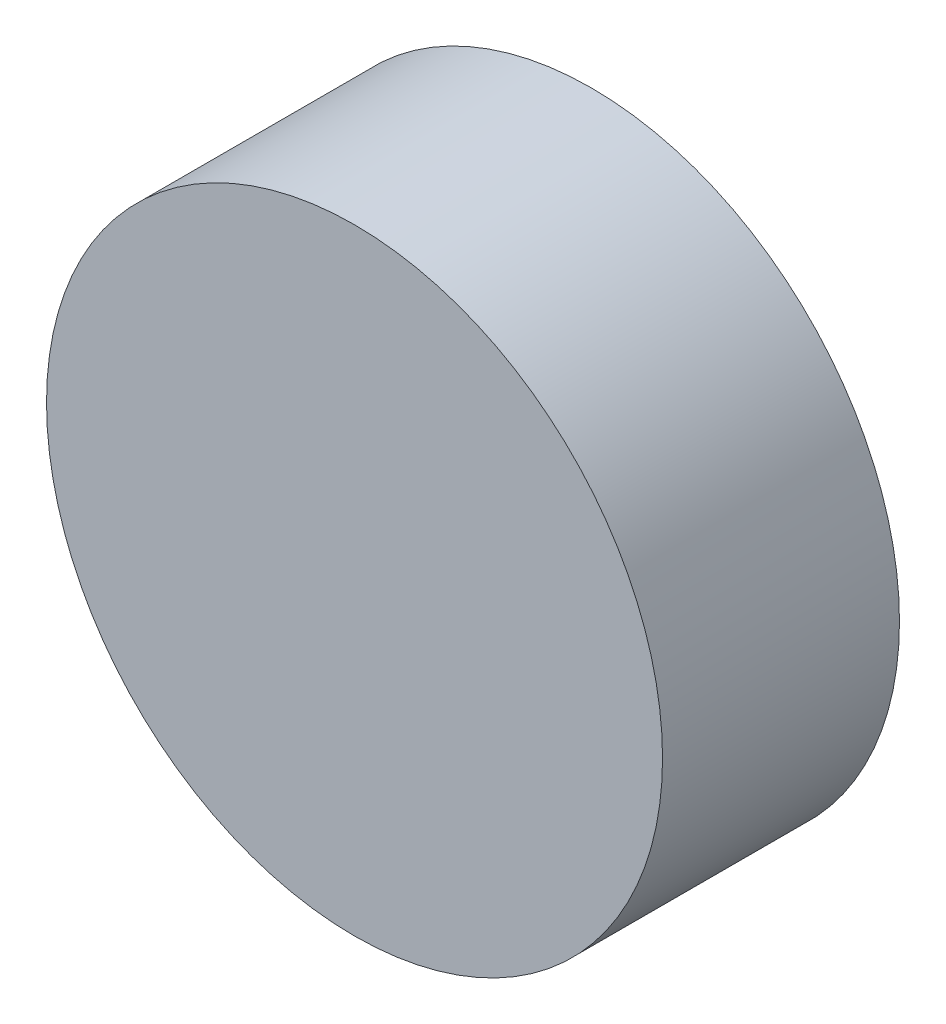
ISO-10303-21;
HEADER;
FILE_DESCRIPTION(('STEP AP214'),'2;1');
FILE_NAME('part.step','',(''),(''),'','','');
FILE_SCHEMA(('AUTOMOTIVE_DESIGN { 1 0 10303 214 1 1 1 1 }'));
ENDSEC;
DATA;
#1=APPLICATION_CONTEXT('core data for automotive mechanical design processes');
#2=APPLICATION_PROTOCOL_DEFINITION('international standard','automotive_design',2000,#1);
#3=PRODUCT_CONTEXT('',#1,'mechanical');
#4=PRODUCT('Part','Part','',(#3));
#5=PRODUCT_RELATED_PRODUCT_CATEGORY('part','',(#4));
#6=PRODUCT_DEFINITION_FORMATION('','',#4);
#7=PRODUCT_DEFINITION_CONTEXT('part definition',#1,'design');
#8=PRODUCT_DEFINITION('design','',#6,#7);
#9=PRODUCT_DEFINITION_SHAPE('','',#8);
#10=(LENGTH_UNIT() NAMED_UNIT(*) SI_UNIT(.MILLI.,.METRE.));
#11=(NAMED_UNIT(*) PLANE_ANGLE_UNIT() SI_UNIT($,.RADIAN.));
#12=(NAMED_UNIT(*) SI_UNIT($,.STERADIAN.) SOLID_ANGLE_UNIT());
#13=UNCERTAINTY_MEASURE_WITH_UNIT(LENGTH_MEASURE(1.E-05),#10,'distance_accuracy_value','');
#14=(GEOMETRIC_REPRESENTATION_CONTEXT(3) GLOBAL_UNCERTAINTY_ASSIGNED_CONTEXT((#13)) GLOBAL_UNIT_ASSIGNED_CONTEXT((#10,
#11,#12)) REPRESENTATION_CONTEXT('',''));
#15=CARTESIAN_POINT('',(0.,0.,0.));
#16=DIRECTION('',(0.,0.,1.));
#17=DIRECTION('',(1.,0.,0.));
#18=AXIS2_PLACEMENT_3D('',#15,#16,#17);
#19=CARTESIAN_POINT('',(-400.,500.,950.15));
#20=DIRECTION('',(0.,0.,-1.));
#21=DIRECTION('',(-1.,0.,0.));
#22=AXIS2_PLACEMENT_3D('',#19,#20,#21);
#23=CYLINDRICAL_SURFACE('',#22,39.);
#24=CARTESIAN_POINT('',(-400.,500.,950.15));
#25=DIRECTION('',(0.,0.,1.));
#26=DIRECTION('',(1.,0.,0.));
#27=AXIS2_PLACEMENT_3D('',#24,#25,#26);
#28=CIRCLE('',#27,39.);
#29=CARTESIAN_POINT('',(-361.,500.,950.15));
#30=VERTEX_POINT('',#29);
#31=EDGE_CURVE('E10',#30,#30,#28,.T.);
#32=ORIENTED_EDGE('',*,*,#31,.F.);
#33=EDGE_LOOP('',(#32));
#34=FACE_BOUND('',#33,.T.);
#35=CARTESIAN_POINT('',(-400.,500.,920.15));
#36=DIRECTION('',(0.,0.,1.));
#37=DIRECTION('',(1.,0.,0.));
#38=AXIS2_PLACEMENT_3D('',#35,#36,#37);
#39=CIRCLE('',#38,39.);
#40=CARTESIAN_POINT('',(-361.,500.,920.15));
#41=VERTEX_POINT('',#40);
#42=EDGE_CURVE('E18',#41,#41,#39,.T.);
#43=ORIENTED_EDGE('',*,*,#42,.T.);
#44=EDGE_LOOP('',(#43));
#45=FACE_BOUND('',#44,.T.);
#46=ADVANCED_FACE('F15',(#34,#45),#23,.T.);
#47=CARTESIAN_POINT('',(-400.,500.,950.15));
#48=DIRECTION('',(0.,0.,1.));
#49=DIRECTION('',(1.,0.,0.));
#50=AXIS2_PLACEMENT_3D('',#47,#48,#49);
#51=PLANE('',#50);
#52=ORIENTED_EDGE('',*,*,#31,.T.);
#53=EDGE_LOOP('',(#52));
#54=FACE_BOUND('',#53,.T.);
#55=ADVANCED_FACE('F36',(#54),#51,.T.);
#56=CARTESIAN_POINT('',(-400.,500.,920.15));
#57=DIRECTION('',(0.,0.,1.));
#58=DIRECTION('',(1.,0.,0.));
#59=AXIS2_PLACEMENT_3D('',#56,#57,#58);
#60=PLANE('',#59);
#61=ORIENTED_EDGE('',*,*,#42,.F.);
#62=EDGE_LOOP('',(#61));
#63=FACE_BOUND('',#62,.T.);
#64=ADVANCED_FACE('F34',(#63),#60,.F.);
#65=CLOSED_SHELL('',(#46,#55,#64));
#66=MANIFOLD_SOLID_BREP('B1',#65);
#67=ADVANCED_BREP_SHAPE_REPRESENTATION('',(#18,#66),#14);
#68=SHAPE_DEFINITION_REPRESENTATION(#9,#67);
ENDSEC;
END-ISO-10303-21;
